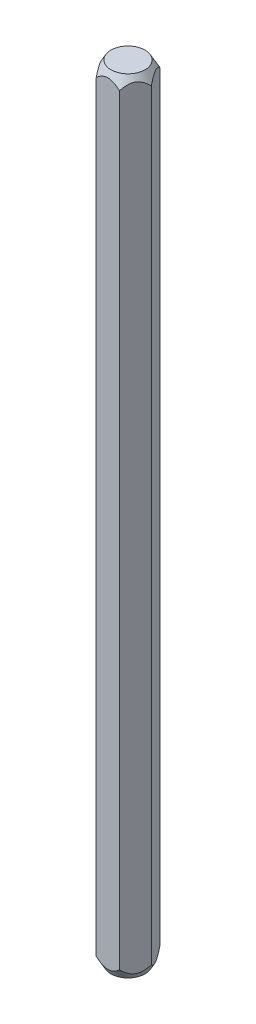
ISO-10303-21;
HEADER;
FILE_DESCRIPTION(('STEP AP214'),'2;1');
FILE_NAME('part.step','',(''),(''),'','','');
FILE_SCHEMA(('AUTOMOTIVE_DESIGN { 1 0 10303 214 1 1 1 1 }'));
ENDSEC;
DATA;
#1=APPLICATION_CONTEXT('core data for automotive mechanical design processes');
#2=APPLICATION_PROTOCOL_DEFINITION('international standard','automotive_design',2000,#1);
#3=PRODUCT_CONTEXT('',#1,'mechanical');
#4=PRODUCT('Part','Part','',(#3));
#5=PRODUCT_RELATED_PRODUCT_CATEGORY('part','',(#4));
#6=PRODUCT_DEFINITION_FORMATION('','',#4);
#7=PRODUCT_DEFINITION_CONTEXT('part definition',#1,'design');
#8=PRODUCT_DEFINITION('design','',#6,#7);
#9=PRODUCT_DEFINITION_SHAPE('','',#8);
#10=(LENGTH_UNIT() NAMED_UNIT(*) SI_UNIT(.MILLI.,.METRE.));
#11=(NAMED_UNIT(*) PLANE_ANGLE_UNIT() SI_UNIT($,.RADIAN.));
#12=(NAMED_UNIT(*) SI_UNIT($,.STERADIAN.) SOLID_ANGLE_UNIT());
#13=UNCERTAINTY_MEASURE_WITH_UNIT(LENGTH_MEASURE(1.E-05),#10,'distance_accuracy_value','');
#14=(GEOMETRIC_REPRESENTATION_CONTEXT(3) GLOBAL_UNCERTAINTY_ASSIGNED_CONTEXT((#13)) GLOBAL_UNIT_ASSIGNED_CONTEXT((#10,
#11,#12)) REPRESENTATION_CONTEXT('',''));
#15=CARTESIAN_POINT('',(0.,0.,0.));
#16=DIRECTION('',(0.,0.,1.));
#17=DIRECTION('',(1.,0.,0.));
#18=AXIS2_PLACEMENT_3D('',#15,#16,#17);
#19=CARTESIAN_POINT('',(0.,-25.25,0.));
#20=DIRECTION('',(0.,1.,0.));
#21=DIRECTION('',(0.,0.,1.));
#22=AXIS2_PLACEMENT_3D('',#19,#20,#21);
#23=PLANE('',#22);
#24=CARTESIAN_POINT('',(0.,-25.25,0.));
#25=DIRECTION('',(0.,-1.,0.));
#26=DIRECTION('',(0.,0.,-1.));
#27=AXIS2_PLACEMENT_3D('',#24,#25,#26);
#28=CIRCLE('',#27,1.1);
#29=CARTESIAN_POINT('',(0.,-25.25,-1.1));
#30=VERTEX_POINT('',#29);
#31=EDGE_CURVE('E212',#30,#30,#28,.T.);
#32=ORIENTED_EDGE('',*,*,#31,.T.);
#33=EDGE_LOOP('',(#32));
#34=FACE_BOUND('',#33,.T.);
#35=ADVANCED_FACE('F36',(#34),#23,.F.);
#36=CARTESIAN_POINT('',(0.,-24.55,0.));
#37=DIRECTION('',(0.,1.,0.));
#38=DIRECTION('',(0.,0.,1.));
#39=AXIS2_PLACEMENT_3D('',#36,#37,#38);
#40=CONICAL_SURFACE('',#39,1.5,0.519146114246523);
#41=ORIENTED_EDGE('',*,*,#31,.F.);
#42=EDGE_LOOP('',(#41));
#43=FACE_BOUND('',#42,.T.);
#44=CARTESIAN_POINT('',(-2.07253485495862,-22.8945054642753,1.29903810567668));
#45=CARTESIAN_POINT('',(-2.03538623793565,-22.9495854387625,1.29903810567668));
#46=CARTESIAN_POINT('',(-1.99804778135317,-23.0045379106194,1.29903810567668));
#47=CARTESIAN_POINT('',(-1.92291943767534,-23.1141377250613,1.29903810567668));
#48=CARTESIAN_POINT('',(-1.8851295256883,-23.1687850505755,1.29903810567668));
#49=CARTESIAN_POINT('',(-1.77082429318834,-23.3324095365471,1.29903810567668));
#50=CARTESIAN_POINT('',(-1.69352606536809,-23.440841663383,1.29903810567667));
#51=CARTESIAN_POINT('',(-1.53196552591618,-23.6611605751849,1.29903810567667));
#52=CARTESIAN_POINT('',(-1.4475497655709,-23.7729362538769,1.29903810567667));
#53=CARTESIAN_POINT('',(-1.31736248949665,-23.937707759074,1.29903810567667));
#54=CARTESIAN_POINT('',(-1.27339385596721,-23.9921251999243,1.29903810567667));
#55=CARTESIAN_POINT('',(-1.18394248532173,-24.0996971859777,1.29903810567667));
#56=CARTESIAN_POINT('',(-1.13845992720303,-24.1528518792159,1.29903810567667));
#57=CARTESIAN_POINT('',(-1.04606630373219,-24.2568956974134,1.29903810567667));
#58=CARTESIAN_POINT('',(-0.999175897510057,-24.3078030562562,1.29903810567667));
#59=CARTESIAN_POINT('',(-0.902905518082989,-24.4073290918742,1.29903810567667));
#60=CARTESIAN_POINT('',(-0.853523188312265,-24.4559455148546,1.29903810567667));
#61=CARTESIAN_POINT('',(-0.75213226077416,-24.5492068812944,1.29903810567666));
#62=CARTESIAN_POINT('',(-0.700159699118796,-24.5938905358105,1.29903810567666));
#63=CARTESIAN_POINT('',(-0.592198590812934,-24.67803583742,1.29903810567666));
#64=CARTESIAN_POINT('',(-0.536218911719418,-24.7175084969099,1.29903810567666));
#65=CARTESIAN_POINT('',(-0.433498084070139,-24.7795405301596,1.29903810567666));
#66=CARTESIAN_POINT('',(-0.387849628266953,-24.8038748512374,1.29903810567666));
#67=CARTESIAN_POINT('',(-0.293526604004846,-24.8457302033474,1.29903810567666));
#68=CARTESIAN_POINT('',(-0.244858958002785,-24.863266197404,1.29903810567666));
#69=CARTESIAN_POINT('',(-0.153193150401335,-24.8870694717298,1.29903810567666));
#70=CARTESIAN_POINT('',(-0.110559843935739,-24.8947054155175,1.29903810567666));
#71=CARTESIAN_POINT('',(-0.0245950358367204,-24.9025133256309,1.29903810567666));
#72=CARTESIAN_POINT('',(0.0187362836021565,-24.9026872090989,1.29903810567666));
#73=CARTESIAN_POINT('',(0.104675897111498,-24.8955528412023,1.29903810567666));
#74=CARTESIAN_POINT('',(0.147285340581522,-24.8882579036111,1.29903810567666));
#75=CARTESIAN_POINT('',(0.230844394471177,-24.8672064684648,1.29903810567665));
#76=CARTESIAN_POINT('',(0.271792683893705,-24.8534449338227,1.29903810567665));
#77=CARTESIAN_POINT('',(0.379155683060805,-24.8096243102184,1.29903810567665));
#78=CARTESIAN_POINT('',(0.443632811839523,-24.774872986136,1.29903810567665));
#79=CARTESIAN_POINT('',(0.536093495284723,-24.7162230265959,1.29903810567665));
#80=CARTESIAN_POINT('',(0.566280834868058,-24.6955205799594,1.29903810567665));
#81=CARTESIAN_POINT('',(0.625395796048654,-24.6523888180353,1.29903810567665));
#82=CARTESIAN_POINT('',(0.654323878891212,-24.6299601435129,1.29903810567665));
#83=CARTESIAN_POINT('',(0.731646260557356,-24.5670177665695,1.29903810567665));
#84=CARTESIAN_POINT('',(0.778952826746301,-24.5251785470326,1.29903810567665));
#85=CARTESIAN_POINT('',(0.871034974400614,-24.4387832099594,1.29903810567665));
#86=CARTESIAN_POINT('',(0.915808803866984,-24.3942252549995,1.29903810567665));
#87=CARTESIAN_POINT('',(1.00345191718129,-24.3030954920219,1.29903810567665));
#88=CARTESIAN_POINT('',(1.04631674732251,-24.2565194285746,1.29903810567665));
#89=CARTESIAN_POINT('',(1.13045799987154,-24.1619490096584,1.29903810567665));
#90=CARTESIAN_POINT('',(1.17173414809037,-24.1139544118706,1.29903810567664));
#91=CARTESIAN_POINT('',(1.29402411346602,-23.9679577797709,1.29903810567664));
#92=CARTESIAN_POINT('',(1.37311876688962,-23.8683520364851,1.29903810567664));
#93=CARTESIAN_POINT('',(1.52779498622431,-23.6666840738683,1.29903810567664));
#94=CARTESIAN_POINT('',(1.60338079775171,-23.5646250626919,1.29903810567664));
#95=CARTESIAN_POINT('',(1.74551356738804,-23.3679594614914,1.29903810567664));
#96=CARTESIAN_POINT('',(1.81226533710322,-23.2735002712326,1.29903810567664));
#97=CARTESIAN_POINT('',(1.94369038410245,-23.0843046189558,1.29903810567664));
#98=CARTESIAN_POINT('',(2.0083763111309,-22.989576959479,1.29903810567664));
#99=CARTESIAN_POINT('',(2.07253485495867,-22.8945054642753,1.29903810567664));
#100=B_SPLINE_CURVE_WITH_KNOTS('',3,(#44,#45,#46,#47,#48,#49,#50,#51,#52,#53,#54,#55,#56,#57,
#58,#59,#60,#61,#62,#63,#64,#65,#66,#67,#68,#69,#70,#71,#72,#73,#74,#75,#76,#77,#78,#79,#80,#81,
#82,#83,#84,#85,#86,#87,#88,#89,#90,#91,#92,#93,#94,#95,#96,#97,#98,#99),.UNSPECIFIED.,.F.,.F.,
(4,2,2,2,2,2,2,2,2,2,2,2,2,2,2,2,2,2,2,2,2,2,2,2,2,2,2,4),(0.,0.199309941791665,
0.398630924034156,0.798094667911537,1.21820476163973,1.42806663426301,1.63790378160688,
1.84548111764697,2.05325857539453,2.25868516950042,2.46367043823924,2.6184799554092,
2.77294677782484,2.90229727841162,3.03161454624822,3.16070169633708,3.289889564593,
3.50827500154841,3.61806680102763,3.72781804122221,3.91711654272996,4.10654442762104,
4.29639328838322,4.48627476936935,4.8677118251966,5.24867463357981,5.59565170158735,
5.93975000862929),.UNSPECIFIED.);
#101=CARTESIAN_POINT('',(-0.749999999999988,-24.55,1.29903810567666));
#102=VERTEX_POINT('',#101);
#103=CARTESIAN_POINT('',(0.750000000000015,-24.55,1.29903810567665));
#104=VERTEX_POINT('',#103);
#105=EDGE_CURVE('E206',#102,#104,#100,.T.);
#106=ORIENTED_EDGE('',*,*,#105,.F.);
#107=CARTESIAN_POINT('',(-1.50011427265704,-24.5498,-0.000197926047899849));
#108=CARTESIAN_POINT('',(-1.4844560329754,-24.577174757968,0.0269229406377882));
#109=CARTESIAN_POINT('',(-1.46848195449817,-24.6038800893295,0.0545908561644519));
#110=CARTESIAN_POINT('',(-1.43569548405084,-24.6555169111973,0.111378688780085));
#111=CARTESIAN_POINT('',(-1.41887901814407,-24.6804380044115,0.140505662134346));
#112=CARTESIAN_POINT('',(-1.38391500160077,-24.7283836425917,0.201065115224031));
#113=CARTESIAN_POINT('',(-1.36574408969252,-24.7513411744891,0.23253805786898));
#114=CARTESIAN_POINT('',(-1.32841093508815,-24.7936117266531,0.297200978450569));
#115=CARTESIAN_POINT('',(-1.30925105807725,-24.8129329732754,0.33038685890021));
#116=CARTESIAN_POINT('',(-1.26838798330661,-24.8480525589006,0.401163780556443));
#117=CARTESIAN_POINT('',(-1.24660186054835,-24.8634770395848,0.43889845207369));
#118=CARTESIAN_POINT('',(-1.20221357157386,-24.8869483088712,0.515781223838549));
#119=CARTESIAN_POINT('',(-1.17961959829794,-24.8950547788082,0.554915133497292));
#120=CARTESIAN_POINT('',(-1.13384224962676,-24.9028895799723,0.634203827231581));
#121=CARTESIAN_POINT('',(-1.11065535633217,-24.9025397632328,0.674364704487473));
#122=CARTESIAN_POINT('',(-1.06467286203397,-24.8933215388631,0.754008720870708));
#123=CARTESIAN_POINT('',(-1.04187839232794,-24.8844317002164,0.793489900533146));
#124=CARTESIAN_POINT('',(-0.991146983129713,-24.8560006684914,0.881359278804034));
#125=CARTESIAN_POINT('',(-0.963537845666472,-24.8341886627298,0.92917970764352));
#126=CARTESIAN_POINT('',(-0.910253599849041,-24.7823504473517,1.0214707286423));
#127=CARTESIAN_POINT('',(-0.884588776237872,-24.7522839857869,1.06592350710414));
#128=CARTESIAN_POINT('',(-0.840391512775698,-24.693815750008,1.14247541297613));
#129=CARTESIAN_POINT('',(-0.821509551399778,-24.6664389030966,1.17517992942577));
#130=CARTESIAN_POINT('',(-0.784926482622608,-24.6095575952382,1.23854366324462));
#131=CARTESIAN_POINT('',(-0.767213792789506,-24.5800831132095,1.26922294197426));
#132=CARTESIAN_POINT('',(-0.749885727342729,-24.5497999999996,1.29923603172495));
#133=B_SPLINE_CURVE_WITH_KNOTS('',3,(#107,#108,#109,#110,#111,#112,#113,#114,#115,#116,#117,
#118,#119,#120,#121,#122,#123,#124,#125,#126,#127,#128,#129,#130,#131,#132),.UNSPECIFIED.,.F.,
.F.,(4,2,2,2,2,2,2,2,2,2,2,2,4),(0.,0.124825594013034,0.250327656131257,0.379126359053955,
0.507630083264508,0.645790755097725,0.7828142157728,0.921104445712332,1.05974262128002,
1.23684404007381,1.41482490290691,1.5546504669262,1.69277279754432),.UNSPECIFIED.);
#134=CARTESIAN_POINT('',(-1.5,-24.55,0.));
#135=VERTEX_POINT('',#134);
#136=EDGE_CURVE('E208',#135,#102,#133,.T.);
#137=ORIENTED_EDGE('',*,*,#136,.F.);
#138=CARTESIAN_POINT('',(-0.749885727342747,-24.5497999999996,-1.29923603172494));
#139=CARTESIAN_POINT('',(-0.765543967024384,-24.5771747579676,-1.27211516503926));
#140=CARTESIAN_POINT('',(-0.781518045501617,-24.6038800893291,-1.2444472495126));
#141=CARTESIAN_POINT('',(-0.814304515948945,-24.655516911197,-1.18765941689697));
#142=CARTESIAN_POINT('',(-0.831120981855705,-24.6804380044111,-1.15853244354271));
#143=CARTESIAN_POINT('',(-0.866084998399008,-24.7283836425914,-1.09797299045303));
#144=CARTESIAN_POINT('',(-0.884255910307257,-24.7513411744888,-1.06650004780808));
#145=CARTESIAN_POINT('',(-0.921589064911621,-24.7936117266528,-1.0018371272265));
#146=CARTESIAN_POINT('',(-0.940748941922514,-24.8129329732752,-0.968651246776862));
#147=CARTESIAN_POINT('',(-0.981612016693152,-24.8480525589004,-0.89787432512063));
#148=CARTESIAN_POINT('',(-1.00339813945142,-24.8634770395847,-0.860139653603381));
#149=CARTESIAN_POINT('',(-1.04778642842591,-24.8869483088711,-0.783256881838516));
#150=CARTESIAN_POINT('',(-1.07038040170183,-24.8950547788082,-0.744122972179768));
#151=CARTESIAN_POINT('',(-1.11615775037302,-24.9028895799723,-0.664834278445462));
#152=CARTESIAN_POINT('',(-1.13934464366761,-24.9025397632328,-0.624673401189559));
#153=CARTESIAN_POINT('',(-1.18532713796583,-24.8933215388632,-0.545029384806297));
#154=CARTESIAN_POINT('',(-1.20812160767187,-24.8844317002165,-0.505548205143846));
#155=CARTESIAN_POINT('',(-1.25885301687008,-24.8560006684915,-0.417678826872971));
#156=CARTESIAN_POINT('',(-1.28646215433331,-24.83418866273,-0.369858398033508));
#157=CARTESIAN_POINT('',(-1.33974640015071,-24.7823504473519,-0.277567377034771));
#158=CARTESIAN_POINT('',(-1.36541122376187,-24.7522839857872,-0.233114598572952));
#159=CARTESIAN_POINT('',(-1.40960848722404,-24.6938157500083,-0.156562692700964));
#160=CARTESIAN_POINT('',(-1.42849044859997,-24.6664389030969,-0.123858176251305));
#161=CARTESIAN_POINT('',(-1.46507351737715,-24.6095575952385,-0.060494442432438));
#162=CARTESIAN_POINT('',(-1.48278620721026,-24.5800831132099,-0.0298151637027866));
#163=CARTESIAN_POINT('',(-1.50011427265704,-24.5498,0.000197926047920182));
#164=B_SPLINE_CURVE_WITH_KNOTS('',3,(#138,#139,#140,#141,#142,#143,#144,#145,#146,#147,#148,
#149,#150,#151,#152,#153,#154,#155,#156,#157,#158,#159,#160,#161,#162,#163),.UNSPECIFIED.,.F.,
.F.,(4,2,2,2,2,2,2,2,2,2,2,2,4),(0.,0.124825594013049,0.250327656131287,0.379126359054002,
0.507630083264572,0.64579075509782,0.782814215772928,0.921104445712497,1.05974262128022,
1.23684404007388,1.41482490290687,1.55465046692618,1.69277279754432),.UNSPECIFIED.);
#165=CARTESIAN_POINT('',(-0.750000000000006,-24.55,-1.29903810567665));
#166=VERTEX_POINT('',#165);
#167=EDGE_CURVE('E93',#166,#135,#164,.T.);
#168=ORIENTED_EDGE('',*,*,#167,.F.);
#169=CARTESIAN_POINT('',(2.07253485495863,-22.8945054642753,-1.29903810567666));
#170=CARTESIAN_POINT('',(2.03538623793566,-22.9495854387625,-1.29903810567666));
#171=CARTESIAN_POINT('',(1.99804778135318,-23.0045379106194,-1.29903810567666));
#172=CARTESIAN_POINT('',(1.92291943767535,-23.1141377250613,-1.29903810567666));
#173=CARTESIAN_POINT('',(1.88512952568831,-23.1687850505755,-1.29903810567666));
#174=CARTESIAN_POINT('',(1.77082429318834,-23.3324095365471,-1.29903810567666));
#175=CARTESIAN_POINT('',(1.6935260653681,-23.440841663383,-1.29903810567666));
#176=CARTESIAN_POINT('',(1.53196552591619,-23.6611605751849,-1.29903810567666));
#177=CARTESIAN_POINT('',(1.44754976557091,-23.7729362538769,-1.29903810567666));
#178=CARTESIAN_POINT('',(1.31736248949666,-23.937707759074,-1.29903810567666));
#179=CARTESIAN_POINT('',(1.27339385596722,-23.9921251999243,-1.29903810567666));
#180=CARTESIAN_POINT('',(1.18394248532174,-24.0996971859777,-1.29903810567666));
#181=CARTESIAN_POINT('',(1.13845992720304,-24.1528518792159,-1.29903810567666));
#182=CARTESIAN_POINT('',(1.0460663037322,-24.2568956974134,-1.29903810567666));
#183=CARTESIAN_POINT('',(0.999175897510066,-24.3078030562562,-1.29903810567666));
#184=CARTESIAN_POINT('',(0.902905518082998,-24.4073290918742,-1.29903810567666));
#185=CARTESIAN_POINT('',(0.853523188312275,-24.4559455148546,-1.29903810567666));
#186=CARTESIAN_POINT('',(0.752132260774169,-24.5492068812944,-1.29903810567666));
#187=CARTESIAN_POINT('',(0.700159699118804,-24.5938905358105,-1.29903810567666));
#188=CARTESIAN_POINT('',(0.592198590812942,-24.67803583742,-1.29903810567666));
#189=CARTESIAN_POINT('',(0.536218911719427,-24.7175084969099,-1.29903810567666));
#190=CARTESIAN_POINT('',(0.433498084070147,-24.7795405301596,-1.29903810567666));
#191=CARTESIAN_POINT('',(0.387849628266961,-24.8038748512374,-1.29903810567666));
#192=CARTESIAN_POINT('',(0.293526604004854,-24.8457302033474,-1.29903810567666));
#193=CARTESIAN_POINT('',(0.244858958002793,-24.863266197404,-1.29903810567666));
#194=CARTESIAN_POINT('',(0.153193150401342,-24.8870694717298,-1.29903810567666));
#195=CARTESIAN_POINT('',(0.110559843935746,-24.8947054155175,-1.29903810567666));
#196=CARTESIAN_POINT('',(0.0245950358367268,-24.9025133256309,-1.29903810567666));
#197=CARTESIAN_POINT('',(-0.0187362836021501,-24.9026872090989,-1.29903810567666));
#198=CARTESIAN_POINT('',(-0.104675897111492,-24.8955528412023,-1.29903810567666));
#199=CARTESIAN_POINT('',(-0.147285340581515,-24.8882579036111,-1.29903810567666));
#200=CARTESIAN_POINT('',(-0.23084439447117,-24.8672064684648,-1.29903810567666));
#201=CARTESIAN_POINT('',(-0.271792683893699,-24.8534449338227,-1.29903810567666));
#202=CARTESIAN_POINT('',(-0.3791556830608,-24.8096243102184,-1.29903810567666));
#203=CARTESIAN_POINT('',(-0.443632811839519,-24.774872986136,-1.29903810567666));
#204=CARTESIAN_POINT('',(-0.53609349528472,-24.7162230265959,-1.29903810567666));
#205=CARTESIAN_POINT('',(-0.566280834868054,-24.6955205799594,-1.29903810567666));
#206=CARTESIAN_POINT('',(-0.62539579604865,-24.6523888180353,-1.29903810567665));
#207=CARTESIAN_POINT('',(-0.654323878891208,-24.6299601435129,-1.29903810567665));
#208=CARTESIAN_POINT('',(-0.731646260557353,-24.5670177665695,-1.29903810567665));
#209=CARTESIAN_POINT('',(-0.778952826746299,-24.5251785470326,-1.29903810567665));
#210=CARTESIAN_POINT('',(-0.871034974400613,-24.4387832099594,-1.29903810567665));
#211=CARTESIAN_POINT('',(-0.915808803866984,-24.3942252549995,-1.29903810567665));
#212=CARTESIAN_POINT('',(-1.00345191718129,-24.3030954920219,-1.29903810567665));
#213=CARTESIAN_POINT('',(-1.04631674732251,-24.2565194285746,-1.29903810567665));
#214=CARTESIAN_POINT('',(-1.13045799987154,-24.1619490096584,-1.29903810567665));
#215=CARTESIAN_POINT('',(-1.17173414809037,-24.1139544118706,-1.29903810567665));
#216=CARTESIAN_POINT('',(-1.29402411346602,-23.9679577797709,-1.29903810567665));
#217=CARTESIAN_POINT('',(-1.37311876688962,-23.8683520364851,-1.29903810567665));
#218=CARTESIAN_POINT('',(-1.52779498622431,-23.6666840738682,-1.29903810567665));
#219=CARTESIAN_POINT('',(-1.60338079775172,-23.5646250626919,-1.29903810567665));
#220=CARTESIAN_POINT('',(-1.74551356738804,-23.3679594614914,-1.29903810567665));
#221=CARTESIAN_POINT('',(-1.81226533710321,-23.2735002712326,-1.29903810567665));
#222=CARTESIAN_POINT('',(-1.94369038410244,-23.0843046189558,-1.29903810567665));
#223=CARTESIAN_POINT('',(-2.00837631113088,-22.9895769594791,-1.29903810567665));
#224=CARTESIAN_POINT('',(-2.07253485495864,-22.8945054642753,-1.29903810567665));
#225=B_SPLINE_CURVE_WITH_KNOTS('',3,(#169,#170,#171,#172,#173,#174,#175,#176,#177,#178,#179,
#180,#181,#182,#183,#184,#185,#186,#187,#188,#189,#190,#191,#192,#193,#194,#195,#196,#197,#198,
#199,#200,#201,#202,#203,#204,#205,#206,#207,#208,#209,#210,#211,#212,#213,#214,#215,#216,#217,
#218,#219,#220,#221,#222,#223,#224),.UNSPECIFIED.,.F.,.F.,(4,2,2,2,2,2,2,2,2,2,2,2,2,2,2,2,2,2,
2,2,2,2,2,2,2,2,2,4),(0.,0.199309941791662,0.398630924034153,0.798094667911537,1.21820476163973,
1.42806663426301,1.63790378160688,1.84548111764697,2.05325857539453,2.25868516950043,
2.46367043823924,2.6184799554092,2.77294677782484,2.90229727841163,3.03161454624822,
3.16070169633708,3.289889564593,3.50827500154842,3.61806680102764,3.72781804122221,
3.91711654272997,4.10654442762105,4.29639328838324,4.48627476936937,4.86771182519662,
5.24867463357984,5.59565170158736,5.93975000862926),.UNSPECIFIED.);
#226=CARTESIAN_POINT('',(0.749999999999997,-24.55,-1.29903810567666));
#227=VERTEX_POINT('',#226);
#228=EDGE_CURVE('E88',#227,#166,#225,.T.);
#229=ORIENTED_EDGE('',*,*,#228,.F.);
#230=CARTESIAN_POINT('',(1.50011427265704,-24.5498,0.000197926047910326));
#231=CARTESIAN_POINT('',(1.4844560329754,-24.577174757968,-0.0269229406377779));
#232=CARTESIAN_POINT('',(1.46848195449817,-24.6038800893295,-0.0545908561644416));
#233=CARTESIAN_POINT('',(1.43569548405084,-24.6555169111973,-0.111378688780075));
#234=CARTESIAN_POINT('',(1.41887901814407,-24.6804380044115,-0.140505662134336));
#235=CARTESIAN_POINT('',(1.38391500160077,-24.7283836425917,-0.201065115224022));
#236=CARTESIAN_POINT('',(1.36574408969252,-24.7513411744891,-0.232538057868971));
#237=CARTESIAN_POINT('',(1.32841093508815,-24.7936117266531,-0.29720097845056));
#238=CARTESIAN_POINT('',(1.30925105807725,-24.8129329732754,-0.330386858900201));
#239=CARTESIAN_POINT('',(1.26838798330661,-24.8480525589006,-0.401163780556435));
#240=CARTESIAN_POINT('',(1.24660186054835,-24.8634770395848,-0.438898452073682));
#241=CARTESIAN_POINT('',(1.20221357157386,-24.8869483088712,-0.515781223838541));
#242=CARTESIAN_POINT('',(1.17961959829795,-24.8950547788082,-0.554915133497284));
#243=CARTESIAN_POINT('',(1.13384224962676,-24.9028895799723,-0.634203827231574));
#244=CARTESIAN_POINT('',(1.11065535633218,-24.9025397632328,-0.674364704487465));
#245=CARTESIAN_POINT('',(1.06467286203397,-24.8933215388631,-0.754008720870701));
#246=CARTESIAN_POINT('',(1.04187839232794,-24.8844317002164,-0.793489900533139));
#247=CARTESIAN_POINT('',(0.991146983129719,-24.8560006684914,-0.881359278804027));
#248=CARTESIAN_POINT('',(0.963537845666479,-24.8341886627298,-0.929179707643513));
#249=CARTESIAN_POINT('',(0.910253599849048,-24.7823504473517,-1.02147072864229));
#250=CARTESIAN_POINT('',(0.884588776237879,-24.7522839857869,-1.06592350710413));
#251=CARTESIAN_POINT('',(0.840391512775706,-24.693815750008,-1.14247541297612));
#252=CARTESIAN_POINT('',(0.821509551399787,-24.6664389030966,-1.17517992942577));
#253=CARTESIAN_POINT('',(0.784926482622618,-24.6095575952382,-1.23854366324461));
#254=CARTESIAN_POINT('',(0.767213792789516,-24.5800831132095,-1.26922294197425));
#255=CARTESIAN_POINT('',(0.749885727342739,-24.5497999999996,-1.29923603172495));
#256=B_SPLINE_CURVE_WITH_KNOTS('',3,(#230,#231,#232,#233,#234,#235,#236,#237,#238,#239,#240,
#241,#242,#243,#244,#245,#246,#247,#248,#249,#250,#251,#252,#253,#254,#255),.UNSPECIFIED.,.F.,
.F.,(4,2,2,2,2,2,2,2,2,2,2,2,4),(0.,0.124825594013034,0.250327656131258,0.379126359053955,
0.507630083264508,0.645790755097725,0.7828142157728,0.921104445712332,1.05974262128002,
1.23684404007381,1.41482490290691,1.5546504669262,1.69277279754432),.UNSPECIFIED.);
#257=CARTESIAN_POINT('',(1.5,-24.55,0.));
#258=VERTEX_POINT('',#257);
#259=EDGE_CURVE('E91',#258,#227,#256,.T.);
#260=ORIENTED_EDGE('',*,*,#259,.F.);
#261=CARTESIAN_POINT('',(0.749885727342757,-24.5497999999996,1.29923603172494));
#262=CARTESIAN_POINT('',(0.765543967024393,-24.5771747579676,1.27211516503925));
#263=CARTESIAN_POINT('',(0.781518045501626,-24.6038800893291,1.24444724951259));
#264=CARTESIAN_POINT('',(0.814304515948955,-24.655516911197,1.18765941689696));
#265=CARTESIAN_POINT('',(0.831120981855715,-24.6804380044111,1.1585324435427));
#266=CARTESIAN_POINT('',(0.866084998399017,-24.7283836425914,1.09797299045302));
#267=CARTESIAN_POINT('',(0.884255910307267,-24.7513411744888,1.06650004780808));
#268=CARTESIAN_POINT('',(0.921589064911631,-24.7936117266528,1.00183712722649));
#269=CARTESIAN_POINT('',(0.940748941922524,-24.8129329732752,0.968651246776854));
#270=CARTESIAN_POINT('',(0.981612016693162,-24.8480525589004,0.897874325120622));
#271=CARTESIAN_POINT('',(1.00339813945143,-24.8634770395847,0.860139653603374));
#272=CARTESIAN_POINT('',(1.04778642842592,-24.8869483088711,0.783256881838509));
#273=CARTESIAN_POINT('',(1.07038040170184,-24.8950547788081,0.74412297217976));
#274=CARTESIAN_POINT('',(1.11615775037303,-24.9028895799723,0.664834278445455));
#275=CARTESIAN_POINT('',(1.13934464366762,-24.9025397632328,0.624673401189552));
#276=CARTESIAN_POINT('',(1.18532713796584,-24.8933215388632,0.545029384806291));
#277=CARTESIAN_POINT('',(1.20812160767188,-24.8844317002165,0.50554820514384));
#278=CARTESIAN_POINT('',(1.25885301687009,-24.8560006684915,0.417678826872965));
#279=CARTESIAN_POINT('',(1.28646215433332,-24.83418866273,0.369858398033502));
#280=CARTESIAN_POINT('',(1.33974640015072,-24.7823504473519,0.277567377034764));
#281=CARTESIAN_POINT('',(1.36541122376188,-24.7522839857872,0.233114598572944));
#282=CARTESIAN_POINT('',(1.40960848722405,-24.6938157500083,0.15656269270096));
#283=CARTESIAN_POINT('',(1.42849044859997,-24.6664389030969,0.123858176251304));
#284=CARTESIAN_POINT('',(1.46507351737715,-24.6095575952385,0.0604944424324435));
#285=CARTESIAN_POINT('',(1.48278620721026,-24.5800831132099,0.0298151637027945));
#286=CARTESIAN_POINT('',(1.50011427265704,-24.5498,-0.000197926047909581));
#287=B_SPLINE_CURVE_WITH_KNOTS('',3,(#261,#262,#263,#264,#265,#266,#267,#268,#269,#270,#271,
#272,#273,#274,#275,#276,#277,#278,#279,#280,#281,#282,#283,#284,#285,#286),.UNSPECIFIED.,.F.,
.F.,(4,2,2,2,2,2,2,2,2,2,2,2,4),(0.,0.124825594013049,0.250327656131285,0.379126359054002,
0.507630083264572,0.645790755097819,0.782814215772926,0.921104445712494,1.05974262128021,
1.23684404007388,1.41482490290688,1.55465046692616,1.69277279754429),.UNSPECIFIED.);
#288=EDGE_CURVE('E60',#104,#258,#287,.T.);
#289=ORIENTED_EDGE('',*,*,#288,.F.);
#290=EDGE_LOOP('',(#106,#137,#168,#229,#260,#289));
#291=FACE_BOUND('',#290,.T.);
#292=ADVANCED_FACE('F90',(#43,#291),#40,.T.);
#293=CARTESIAN_POINT('',(0.750000000000015,25.25,1.29903810567665));
#294=DIRECTION('',(-0.866025403784442,0.,-0.499999999999995));
#295=DIRECTION('',(-0.499999999999995,0.,0.866025403784442));
#296=AXIS2_PLACEMENT_3D('',#293,#294,#295);
#297=PLANE('',#296);
#298=DIRECTION('',(0.,-1.,0.));
#299=VECTOR('',#298,1.);
#300=CARTESIAN_POINT('',(1.5,25.25,0.));
#301=LINE('',#300,#299);
#302=CARTESIAN_POINT('',(1.5,24.55,0.));
#303=VERTEX_POINT('',#302);
#304=EDGE_CURVE('E11',#303,#258,#301,.T.);
#305=ORIENTED_EDGE('',*,*,#304,.F.);
#306=CARTESIAN_POINT('',(1.50011427265704,24.5498,-0.000197926047910144));
#307=CARTESIAN_POINT('',(1.4844560329754,24.577174757968,0.0269229406377771));
#308=CARTESIAN_POINT('',(1.46848195449817,24.6038800893295,0.0545908561644401));
#309=CARTESIAN_POINT('',(1.43569548405084,24.6555169111973,0.111378688780074));
#310=CARTESIAN_POINT('',(1.41887901814408,24.6804380044115,0.140505662134336));
#311=CARTESIAN_POINT('',(1.38391500160077,24.7283836425917,0.201065115224022));
#312=CARTESIAN_POINT('',(1.36574408969252,24.7513411744891,0.232538057868972));
#313=CARTESIAN_POINT('',(1.32841093508815,24.7936117266531,0.297200978450562));
#314=CARTESIAN_POINT('',(1.30925105807726,24.8129329732754,0.330386858900204));
#315=CARTESIAN_POINT('',(1.26838798330662,24.8480525589006,0.401163780556439));
#316=CARTESIAN_POINT('',(1.24660186054835,24.8634770395848,0.438898452073686));
#317=CARTESIAN_POINT('',(1.20221357157387,24.8869483088712,0.515781223838545));
#318=CARTESIAN_POINT('',(1.17961959829795,24.8950547788082,0.554915133497289));
#319=CARTESIAN_POINT('',(1.13384224962676,24.9028895799723,0.634203827231579));
#320=CARTESIAN_POINT('',(1.11065535633218,24.9025397632328,0.674364704487471));
#321=CARTESIAN_POINT('',(1.06467286203398,24.8933215388631,0.754008720870707));
#322=CARTESIAN_POINT('',(1.04187839232795,24.8844317002164,0.793489900533144));
#323=CARTESIAN_POINT('',(0.991146983129724,24.8560006684914,0.881359278804033));
#324=CARTESIAN_POINT('',(0.963537845666483,24.8341886627298,0.92917970764352));
#325=CARTESIAN_POINT('',(0.910253599849052,24.7823504473517,1.0214707286423));
#326=CARTESIAN_POINT('',(0.884588776237883,24.7522839857869,1.06592350710414));
#327=CARTESIAN_POINT('',(0.840391512775713,24.693815750008,1.14247541297613));
#328=CARTESIAN_POINT('',(0.821509551399796,24.6664389030966,1.17517992942577));
#329=CARTESIAN_POINT('',(0.784926482622631,24.6095575952382,1.23854366324461));
#330=CARTESIAN_POINT('',(0.767213792789532,24.5800831132095,1.26922294197424));
#331=CARTESIAN_POINT('',(0.749885727342757,24.5497999999996,1.29923603172494));
#332=B_SPLINE_CURVE_WITH_KNOTS('',3,(#306,#307,#308,#309,#310,#311,#312,#313,#314,#315,#316,
#317,#318,#319,#320,#321,#322,#323,#324,#325,#326,#327,#328,#329,#330,#331),.UNSPECIFIED.,.F.,
.F.,(4,2,2,2,2,2,2,2,2,2,2,2,4),(0.,0.124825594013029,0.250327656131255,0.379126359053954,
0.507630083264508,0.645790755097724,0.7828142157728,0.921104445712332,1.05974262128002,
1.23684404007381,1.41482490290692,1.55465046692619,1.69277279754429),.UNSPECIFIED.);
#333=CARTESIAN_POINT('',(0.750000000000015,24.55,1.29903810567665));
#334=VERTEX_POINT('',#333);
#335=EDGE_CURVE('E120',#303,#334,#332,.T.);
#336=ORIENTED_EDGE('',*,*,#335,.T.);
#337=DIRECTION('',(0.,-1.,0.));
#338=VECTOR('',#337,1.);
#339=CARTESIAN_POINT('',(0.750000000000015,25.25,1.29903810567665));
#340=LINE('',#339,#338);
#341=EDGE_CURVE('E117',#334,#104,#340,.T.);
#342=ORIENTED_EDGE('',*,*,#341,.T.);
#343=ORIENTED_EDGE('',*,*,#288,.T.);
#344=EDGE_LOOP('',(#305,#336,#342,#343));
#345=FACE_BOUND('',#344,.T.);
#346=ADVANCED_FACE('F38',(#345),#297,.F.);
#347=CARTESIAN_POINT('',(1.5,25.25,0.));
#348=DIRECTION('',(-0.866025403784438,0.,0.500000000000001));
#349=DIRECTION('',(0.500000000000001,0.,0.866025403784438));
#350=AXIS2_PLACEMENT_3D('',#347,#348,#349);
#351=PLANE('',#350);
#352=DIRECTION('',(0.,-1.,0.));
#353=VECTOR('',#352,1.);
#354=CARTESIAN_POINT('',(0.749999999999997,25.25,-1.29903810567666));
#355=LINE('',#354,#353);
#356=CARTESIAN_POINT('',(0.749999999999997,24.55,-1.29903810567666));
#357=VERTEX_POINT('',#356);
#358=EDGE_CURVE('E45',#357,#227,#355,.T.);
#359=ORIENTED_EDGE('',*,*,#358,.F.);
#360=CARTESIAN_POINT('',(0.749885727342739,24.5497999999996,-1.29923603172495));
#361=CARTESIAN_POINT('',(0.765543967024375,24.5771747579676,-1.27211516503926));
#362=CARTESIAN_POINT('',(0.781518045501609,24.6038800893291,-1.2444472495126));
#363=CARTESIAN_POINT('',(0.814304515948937,24.655516911197,-1.18765941689697));
#364=CARTESIAN_POINT('',(0.831120981855697,24.6804380044111,-1.15853244354271));
#365=CARTESIAN_POINT('',(0.866084998399,24.7283836425914,-1.09797299045303));
#366=CARTESIAN_POINT('',(0.88425591030725,24.7513411744888,-1.06650004780809));
#367=CARTESIAN_POINT('',(0.921589064911614,24.7936117266528,-1.00183712722651));
#368=CARTESIAN_POINT('',(0.940748941922507,24.8129329732752,-0.968651246776868));
#369=CARTESIAN_POINT('',(0.981612016693146,24.8480525589004,-0.897874325120636));
#370=CARTESIAN_POINT('',(1.00339813945141,24.8634770395847,-0.860139653603388));
#371=CARTESIAN_POINT('',(1.0477864284259,24.8869483088711,-0.783256881838524));
#372=CARTESIAN_POINT('',(1.07038040170182,24.8950547788082,-0.744122972179776));
#373=CARTESIAN_POINT('',(1.11615775037302,24.9028895799723,-0.664834278445471));
#374=CARTESIAN_POINT('',(1.1393446436676,24.9025397632328,-0.624673401189568));
#375=CARTESIAN_POINT('',(1.18532713796582,24.8933215388632,-0.545029384806307));
#376=CARTESIAN_POINT('',(1.20812160767186,24.8844317002165,-0.505548205143856));
#377=CARTESIAN_POINT('',(1.25885301687008,24.8560006684915,-0.417678826872981));
#378=CARTESIAN_POINT('',(1.2864621543333,24.83418866273,-0.369858398033518));
#379=CARTESIAN_POINT('',(1.33974640015071,24.7823504473519,-0.277567377034782));
#380=CARTESIAN_POINT('',(1.36541122376187,24.7522839857872,-0.233114598572963));
#381=CARTESIAN_POINT('',(1.40960848722404,24.6938157500083,-0.156562692700976));
#382=CARTESIAN_POINT('',(1.42849044859997,24.6664389030969,-0.123858176251316));
#383=CARTESIAN_POINT('',(1.46507351737715,24.6095575952385,-0.0604944424324486));
#384=CARTESIAN_POINT('',(1.48278620721026,24.5800831132099,-0.0298151637027971));
#385=CARTESIAN_POINT('',(1.50011427265704,24.5498,0.000197926047909349));
#386=B_SPLINE_CURVE_WITH_KNOTS('',3,(#360,#361,#362,#363,#364,#365,#366,#367,#368,#369,#370,
#371,#372,#373,#374,#375,#376,#377,#378,#379,#380,#381,#382,#383,#384,#385),.UNSPECIFIED.,.F.,
.F.,(4,2,2,2,2,2,2,2,2,2,2,2,4),(0.,0.124825594013046,0.250327656131285,0.379126359054,
0.50763008326457,0.645790755097817,0.782814215772924,0.921104445712493,1.05974262128021,
1.23684404007388,1.41482490290687,1.55465046692618,1.69277279754432),.UNSPECIFIED.);
#387=EDGE_CURVE('E128',#357,#303,#386,.T.);
#388=ORIENTED_EDGE('',*,*,#387,.T.);
#389=ORIENTED_EDGE('',*,*,#304,.T.);
#390=ORIENTED_EDGE('',*,*,#259,.T.);
#391=EDGE_LOOP('',(#359,#388,#389,#390));
#392=FACE_BOUND('',#391,.T.);
#393=ADVANCED_FACE('F101',(#392),#351,.F.);
#394=CARTESIAN_POINT('',(0.749999999999997,25.25,-1.29903810567666));
#395=DIRECTION('',(0.,0.,1.));
#396=DIRECTION('',(1.,0.,0.));
#397=AXIS2_PLACEMENT_3D('',#394,#395,#396);
#398=PLANE('',#397);
#399=DIRECTION('',(0.,-1.,0.));
#400=VECTOR('',#399,1.);
#401=CARTESIAN_POINT('',(-0.750000000000006,25.25,-1.29903810567665));
#402=LINE('',#401,#400);
#403=CARTESIAN_POINT('',(-0.750000000000006,24.55,-1.29903810567665));
#404=VERTEX_POINT('',#403);
#405=EDGE_CURVE('E108',#404,#166,#402,.T.);
#406=ORIENTED_EDGE('',*,*,#405,.F.);
#407=CARTESIAN_POINT('',(-2.07253485495864,22.8945054642753,-1.29903810567665));
#408=CARTESIAN_POINT('',(-2.03538623793567,22.9495854387625,-1.29903810567665));
#409=CARTESIAN_POINT('',(-1.99804778135319,23.0045379106194,-1.29903810567665));
#410=CARTESIAN_POINT('',(-1.92291943767536,23.1141377250613,-1.29903810567665));
#411=CARTESIAN_POINT('',(-1.88512952568831,23.1687850505755,-1.29903810567665));
#412=CARTESIAN_POINT('',(-1.77082429318835,23.3324095365471,-1.29903810567665));
#413=CARTESIAN_POINT('',(-1.69352606536811,23.440841663383,-1.29903810567665));
#414=CARTESIAN_POINT('',(-1.5319655259162,23.6611605751849,-1.29903810567665));
#415=CARTESIAN_POINT('',(-1.44754976557092,23.7729362538768,-1.29903810567665));
#416=CARTESIAN_POINT('',(-1.31736248949667,23.937707759074,-1.29903810567665));
#417=CARTESIAN_POINT('',(-1.27339385596723,23.9921251999243,-1.29903810567665));
#418=CARTESIAN_POINT('',(-1.18394248532175,24.0996971859777,-1.29903810567665));
#419=CARTESIAN_POINT('',(-1.13845992720305,24.1528518792159,-1.29903810567665));
#420=CARTESIAN_POINT('',(-1.04606630373221,24.2568956974134,-1.29903810567665));
#421=CARTESIAN_POINT('',(-0.999175897510075,24.3078030562562,-1.29903810567665));
#422=CARTESIAN_POINT('',(-0.902905518083007,24.4073290918742,-1.29903810567665));
#423=CARTESIAN_POINT('',(-0.853523188312284,24.4559455148546,-1.29903810567665));
#424=CARTESIAN_POINT('',(-0.752132260774178,24.5492068812944,-1.29903810567665));
#425=CARTESIAN_POINT('',(-0.700159699118813,24.5938905358105,-1.29903810567665));
#426=CARTESIAN_POINT('',(-0.592198590812951,24.67803583742,-1.29903810567666));
#427=CARTESIAN_POINT('',(-0.536218911719436,24.7175084969099,-1.29903810567666));
#428=CARTESIAN_POINT('',(-0.433498084070156,24.7795405301596,-1.29903810567666));
#429=CARTESIAN_POINT('',(-0.38784962826697,24.8038748512374,-1.29903810567666));
#430=CARTESIAN_POINT('',(-0.293526604004863,24.8457302033474,-1.29903810567666));
#431=CARTESIAN_POINT('',(-0.244858958002802,24.863266197404,-1.29903810567666));
#432=CARTESIAN_POINT('',(-0.153193150401351,24.8870694717298,-1.29903810567666));
#433=CARTESIAN_POINT('',(-0.110559843935755,24.8947054155175,-1.29903810567666));
#434=CARTESIAN_POINT('',(-0.0245950358367362,24.9025133256309,-1.29903810567666));
#435=CARTESIAN_POINT('',(0.0187362836021408,24.9026872090989,-1.29903810567666));
#436=CARTESIAN_POINT('',(0.104675897111482,24.8955528412023,-1.29903810567666));
#437=CARTESIAN_POINT('',(0.147285340581506,24.8882579036111,-1.29903810567666));
#438=CARTESIAN_POINT('',(0.230844394471161,24.8672064684648,-1.29903810567666));
#439=CARTESIAN_POINT('',(0.271792683893689,24.8534449338227,-1.29903810567666));
#440=CARTESIAN_POINT('',(0.379155683060791,24.8096243102184,-1.29903810567666));
#441=CARTESIAN_POINT('',(0.443632811839509,24.774872986136,-1.29903810567666));
#442=CARTESIAN_POINT('',(0.53609349528471,24.7162230265959,-1.29903810567666));
#443=CARTESIAN_POINT('',(0.566280834868044,24.6955205799594,-1.29903810567666));
#444=CARTESIAN_POINT('',(0.62539579604864,24.6523888180353,-1.29903810567666));
#445=CARTESIAN_POINT('',(0.654323878891198,24.6299601435129,-1.29903810567666));
#446=CARTESIAN_POINT('',(0.731646260557342,24.5670177665695,-1.29903810567666));
#447=CARTESIAN_POINT('',(0.778952826746288,24.5251785470326,-1.29903810567666));
#448=CARTESIAN_POINT('',(0.871034974400601,24.4387832099594,-1.29903810567666));
#449=CARTESIAN_POINT('',(0.915808803866971,24.3942252549995,-1.29903810567666));
#450=CARTESIAN_POINT('',(1.00345191718128,24.3030954920219,-1.29903810567666));
#451=CARTESIAN_POINT('',(1.04631674732249,24.2565194285746,-1.29903810567666));
#452=CARTESIAN_POINT('',(1.13045799987153,24.1619490096584,-1.29903810567666));
#453=CARTESIAN_POINT('',(1.17173414809035,24.1139544118706,-1.29903810567666));
#454=CARTESIAN_POINT('',(1.29402411346601,23.9679577797709,-1.29903810567666));
#455=CARTESIAN_POINT('',(1.3731187668896,23.8683520364851,-1.29903810567666));
#456=CARTESIAN_POINT('',(1.5277949862243,23.6666840738683,-1.29903810567666));
#457=CARTESIAN_POINT('',(1.6033807977517,23.5646250626919,-1.29903810567666));
#458=CARTESIAN_POINT('',(1.74551356738803,23.3679594614914,-1.29903810567666));
#459=CARTESIAN_POINT('',(1.8122653371032,23.2735002712326,-1.29903810567666));
#460=CARTESIAN_POINT('',(1.94369038410243,23.0843046189558,-1.29903810567666));
#461=CARTESIAN_POINT('',(2.00837631113087,22.9895769594791,-1.29903810567666));
#462=CARTESIAN_POINT('',(2.07253485495863,22.8945054642753,-1.29903810567666));
#463=B_SPLINE_CURVE_WITH_KNOTS('',3,(#407,#408,#409,#410,#411,#412,#413,#414,#415,#416,#417,
#418,#419,#420,#421,#422,#423,#424,#425,#426,#427,#428,#429,#430,#431,#432,#433,#434,#435,#436,
#437,#438,#439,#440,#441,#442,#443,#444,#445,#446,#447,#448,#449,#450,#451,#452,#453,#454,#455,
#456,#457,#458,#459,#460,#461,#462),.UNSPECIFIED.,.F.,.F.,(4,2,2,2,2,2,2,2,2,2,2,2,2,2,2,2,2,2,
2,2,2,2,2,2,2,2,2,4),(0.,0.199309941791661,0.398630924034153,0.798094667911537,1.21820476163973,
1.42806663426301,1.63790378160688,1.84548111764697,2.05325857539453,2.25868516950042,
2.46367043823923,2.6184799554092,2.77294677782484,2.90229727841163,3.03161454624822,
3.16070169633708,3.289889564593,3.50827500154842,3.61806680102764,3.72781804122221,
3.91711654272996,4.10654442762105,4.29639328838323,4.48627476936936,4.86771182519661,
5.24867463357983,5.59565170158735,5.93975000862926),.UNSPECIFIED.);
#464=EDGE_CURVE('E107',#404,#357,#463,.T.);
#465=ORIENTED_EDGE('',*,*,#464,.T.);
#466=ORIENTED_EDGE('',*,*,#358,.T.);
#467=ORIENTED_EDGE('',*,*,#228,.T.);
#468=EDGE_LOOP('',(#406,#465,#466,#467));
#469=FACE_BOUND('',#468,.T.);
#470=ADVANCED_FACE('F106',(#469),#398,.F.);
#471=CARTESIAN_POINT('',(-0.750000000000006,25.25,-1.29903810567665));
#472=DIRECTION('',(0.866025403784442,0.,0.499999999999995));
#473=DIRECTION('',(0.499999999999995,0.,-0.866025403784442));
#474=AXIS2_PLACEMENT_3D('',#471,#472,#473);
#475=PLANE('',#474);
#476=DIRECTION('',(0.,-1.,0.));
#477=VECTOR('',#476,1.);
#478=CARTESIAN_POINT('',(-1.5,25.25,0.));
#479=LINE('',#478,#477);
#480=CARTESIAN_POINT('',(-1.5,24.55,0.));
#481=VERTEX_POINT('',#480);
#482=EDGE_CURVE('E109',#481,#135,#479,.T.);
#483=ORIENTED_EDGE('',*,*,#482,.F.);
#484=CARTESIAN_POINT('',(-1.50011427265704,24.5498,0.000197926047920883));
#485=CARTESIAN_POINT('',(-1.4844560329754,24.577174757968,-0.0269229406377675));
#486=CARTESIAN_POINT('',(-1.46848195449817,24.6038800893295,-0.0545908561644314));
#487=CARTESIAN_POINT('',(-1.43569548405084,24.6555169111973,-0.111378688780065));
#488=CARTESIAN_POINT('',(-1.41887901814408,24.6804380044115,-0.140505662134326));
#489=CARTESIAN_POINT('',(-1.38391500160077,24.7283836425917,-0.201065115224011));
#490=CARTESIAN_POINT('',(-1.36574408969252,24.7513411744891,-0.232538057868961));
#491=CARTESIAN_POINT('',(-1.32841093508815,24.7936117266531,-0.29720097845055));
#492=CARTESIAN_POINT('',(-1.30925105807726,24.8129329732754,-0.330386858900191));
#493=CARTESIAN_POINT('',(-1.26838798330662,24.8480525589006,-0.401163780556425));
#494=CARTESIAN_POINT('',(-1.24660186054835,24.8634770395848,-0.438898452073672));
#495=CARTESIAN_POINT('',(-1.20221357157387,24.8869483088712,-0.515781223838531));
#496=CARTESIAN_POINT('',(-1.17961959829795,24.8950547788082,-0.554915133497275));
#497=CARTESIAN_POINT('',(-1.13384224962676,24.9028895799723,-0.634203827231565));
#498=CARTESIAN_POINT('',(-1.11065535633218,24.9025397632328,-0.674364704487457));
#499=CARTESIAN_POINT('',(-1.06467286203398,24.8933215388631,-0.754008720870693));
#500=CARTESIAN_POINT('',(-1.04187839232795,24.8844317002164,-0.793489900533131));
#501=CARTESIAN_POINT('',(-0.991146983129726,24.8560006684914,-0.88135927880402));
#502=CARTESIAN_POINT('',(-0.963537845666485,24.8341886627298,-0.929179707643506));
#503=CARTESIAN_POINT('',(-0.910253599849055,24.7823504473517,-1.02147072864229));
#504=CARTESIAN_POINT('',(-0.884588776237887,24.7522839857869,-1.06592350710412));
#505=CARTESIAN_POINT('',(-0.840391512775714,24.693815750008,-1.14247541297611));
#506=CARTESIAN_POINT('',(-0.821509551399794,24.6664389030966,-1.17517992942576));
#507=CARTESIAN_POINT('',(-0.784926482622625,24.6095575952382,-1.23854366324461));
#508=CARTESIAN_POINT('',(-0.767213792789524,24.5800831132095,-1.26922294197425));
#509=CARTESIAN_POINT('',(-0.749885727342747,24.5497999999996,-1.29923603172494));
#510=B_SPLINE_CURVE_WITH_KNOTS('',3,(#484,#485,#486,#487,#488,#489,#490,#491,#492,#493,#494,
#495,#496,#497,#498,#499,#500,#501,#502,#503,#504,#505,#506,#507,#508,#509),.UNSPECIFIED.,.F.,
.F.,(4,2,2,2,2,2,2,2,2,2,2,2,4),(0.,0.124825594013034,0.250327656131257,0.379126359053955,
0.507630083264507,0.645790755097724,0.782814215772799,0.921104445712332,1.05974262128002,
1.23684404007381,1.41482490290691,1.5546504669262,1.69277279754432),.UNSPECIFIED.);
#511=EDGE_CURVE('E163',#481,#404,#510,.T.);
#512=ORIENTED_EDGE('',*,*,#511,.T.);
#513=ORIENTED_EDGE('',*,*,#405,.T.);
#514=ORIENTED_EDGE('',*,*,#167,.T.);
#515=EDGE_LOOP('',(#483,#512,#513,#514));
#516=FACE_BOUND('',#515,.T.);
#517=ADVANCED_FACE('F176',(#516),#475,.F.);
#518=CARTESIAN_POINT('',(-1.5,25.25,0.));
#519=DIRECTION('',(0.866025403784435,0.,-0.500000000000007));
#520=DIRECTION('',(-0.500000000000007,0.,-0.866025403784435));
#521=AXIS2_PLACEMENT_3D('',#518,#519,#520);
#522=PLANE('',#521);
#523=DIRECTION('',(0.,-1.,0.));
#524=VECTOR('',#523,1.);
#525=CARTESIAN_POINT('',(-0.749999999999988,25.25,1.29903810567666));
#526=LINE('',#525,#524);
#527=CARTESIAN_POINT('',(-0.749999999999988,24.55,1.29903810567666));
#528=VERTEX_POINT('',#527);
#529=EDGE_CURVE('E114',#528,#102,#526,.T.);
#530=ORIENTED_EDGE('',*,*,#529,.F.);
#531=CARTESIAN_POINT('',(-0.74988572734273,24.5497999999996,1.29923603172495));
#532=CARTESIAN_POINT('',(-0.765543967024366,24.5771747579676,1.27211516503927));
#533=CARTESIAN_POINT('',(-0.7815180455016,24.6038800893291,1.24444724951261));
#534=CARTESIAN_POINT('',(-0.814304515948928,24.655516911197,1.18765941689698));
#535=CARTESIAN_POINT('',(-0.831120981855688,24.6804380044111,1.15853244354272));
#536=CARTESIAN_POINT('',(-0.866084998398991,24.7283836425914,1.09797299045304));
#537=CARTESIAN_POINT('',(-0.884255910307241,24.7513411744888,1.0665000478081));
#538=CARTESIAN_POINT('',(-0.921589064911606,24.7936117266528,1.00183712722651));
#539=CARTESIAN_POINT('',(-0.9407489419225,24.8129329732752,0.968651246776875));
#540=CARTESIAN_POINT('',(-0.981612016693139,24.8480525589004,0.897874325120643));
#541=CARTESIAN_POINT('',(-1.00339813945141,24.8634770395847,0.860139653603395));
#542=CARTESIAN_POINT('',(-1.0477864284259,24.8869483088711,0.783256881838531));
#543=CARTESIAN_POINT('',(-1.07038040170182,24.8950547788082,0.744122972179783));
#544=CARTESIAN_POINT('',(-1.11615775037301,24.9028895799723,0.664834278445478));
#545=CARTESIAN_POINT('',(-1.1393446436676,24.9025397632328,0.624673401189576));
#546=CARTESIAN_POINT('',(-1.18532713796582,24.8933215388632,0.545029384806315));
#547=CARTESIAN_POINT('',(-1.20812160767186,24.8844317002165,0.505548205143864));
#548=CARTESIAN_POINT('',(-1.25885301687007,24.8560006684915,0.41767882687299));
#549=CARTESIAN_POINT('',(-1.2864621543333,24.83418866273,0.369858398033527));
#550=CARTESIAN_POINT('',(-1.33974640015071,24.7823504473519,0.277567377034791));
#551=CARTESIAN_POINT('',(-1.36541122376187,24.7522839857872,0.233114598572973));
#552=CARTESIAN_POINT('',(-1.40960848722404,24.6938157500083,0.156562692700986));
#553=CARTESIAN_POINT('',(-1.42849044859997,24.6664389030969,0.123858176251326));
#554=CARTESIAN_POINT('',(-1.46507351737715,24.6095575952385,0.0604944424324588));
#555=CARTESIAN_POINT('',(-1.48278620721026,24.5800831132099,0.0298151637028076));
#556=CARTESIAN_POINT('',(-1.50011427265704,24.5498,-0.000197926047898801));
#557=B_SPLINE_CURVE_WITH_KNOTS('',3,(#531,#532,#533,#534,#535,#536,#537,#538,#539,#540,#541,
#542,#543,#544,#545,#546,#547,#548,#549,#550,#551,#552,#553,#554,#555,#556),.UNSPECIFIED.,.F.,
.F.,(4,2,2,2,2,2,2,2,2,2,2,2,4),(0.,0.124825594013048,0.250327656131283,0.379126359053998,
0.507630083264572,0.645790755097819,0.782814215772926,0.921104445712495,1.05974262128021,
1.23684404007388,1.41482490290687,1.55465046692618,1.69277279754432),.UNSPECIFIED.);
#558=EDGE_CURVE('E52',#528,#481,#557,.T.);
#559=ORIENTED_EDGE('',*,*,#558,.T.);
#560=ORIENTED_EDGE('',*,*,#482,.T.);
#561=ORIENTED_EDGE('',*,*,#136,.T.);
#562=EDGE_LOOP('',(#530,#559,#560,#561));
#563=FACE_BOUND('',#562,.T.);
#564=ADVANCED_FACE('F226',(#563),#522,.F.);
#565=CARTESIAN_POINT('',(-0.749999999999988,25.25,1.29903810567666));
#566=DIRECTION('',(0.,0.,-1.));
#567=DIRECTION('',(-1.,0.,0.));
#568=AXIS2_PLACEMENT_3D('',#565,#566,#567);
#569=PLANE('',#568);
#570=ORIENTED_EDGE('',*,*,#341,.F.);
#571=CARTESIAN_POINT('',(2.07253485495867,22.8945054642753,1.29903810567664));
#572=CARTESIAN_POINT('',(2.0353862379357,22.9495854387624,1.29903810567664));
#573=CARTESIAN_POINT('',(1.99804778135321,23.0045379106193,1.29903810567664));
#574=CARTESIAN_POINT('',(1.92291943767538,23.1141377250612,1.29903810567664));
#575=CARTESIAN_POINT('',(1.88512952568834,23.1687850505755,1.29903810567664));
#576=CARTESIAN_POINT('',(1.77082429318838,23.3324095365471,1.29903810567664));
#577=CARTESIAN_POINT('',(1.69352606536813,23.440841663383,1.29903810567664));
#578=CARTESIAN_POINT('',(1.53196552591622,23.6611605751849,1.29903810567664));
#579=CARTESIAN_POINT('',(1.44754976557094,23.7729362538768,1.29903810567664));
#580=CARTESIAN_POINT('',(1.31736248949669,23.937707759074,1.29903810567664));
#581=CARTESIAN_POINT('',(1.27339385596725,23.9921251999243,1.29903810567664));
#582=CARTESIAN_POINT('',(1.18394248532177,24.0996971859777,1.29903810567664));
#583=CARTESIAN_POINT('',(1.13845992720307,24.1528518792159,1.29903810567665));
#584=CARTESIAN_POINT('',(1.04606630373223,24.2568956974133,1.29903810567665));
#585=CARTESIAN_POINT('',(0.999175897510096,24.3078030562562,1.29903810567665));
#586=CARTESIAN_POINT('',(0.902905518083027,24.4073290918742,1.29903810567665));
#587=CARTESIAN_POINT('',(0.853523188312303,24.4559455148546,1.29903810567665));
#588=CARTESIAN_POINT('',(0.752132260774198,24.5492068812944,1.29903810567665));
#589=CARTESIAN_POINT('',(0.700159699118833,24.5938905358105,1.29903810567665));
#590=CARTESIAN_POINT('',(0.592198590812972,24.67803583742,1.29903810567665));
#591=CARTESIAN_POINT('',(0.536218911719456,24.7175084969099,1.29903810567665));
#592=CARTESIAN_POINT('',(0.433498084070178,24.7795405301596,1.29903810567665));
#593=CARTESIAN_POINT('',(0.387849628266993,24.8038748512374,1.29903810567665));
#594=CARTESIAN_POINT('',(0.293526604004886,24.8457302033474,1.29903810567665));
#595=CARTESIAN_POINT('',(0.244858958002824,24.863266197404,1.29903810567665));
#596=CARTESIAN_POINT('',(0.153193150401373,24.8870694717298,1.29903810567666));
#597=CARTESIAN_POINT('',(0.110559843935777,24.8947054155175,1.29903810567666));
#598=CARTESIAN_POINT('',(0.0245950358367573,24.9025133256309,1.29903810567666));
#599=CARTESIAN_POINT('',(-0.01873628360212,24.9026872090989,1.29903810567666));
#600=CARTESIAN_POINT('',(-0.104675897111461,24.8955528412023,1.29903810567666));
#601=CARTESIAN_POINT('',(-0.147285340581485,24.8882579036111,1.29903810567666));
#602=CARTESIAN_POINT('',(-0.230844394471141,24.8672064684648,1.29903810567666));
#603=CARTESIAN_POINT('',(-0.27179268389367,24.8534449338227,1.29903810567666));
#604=CARTESIAN_POINT('',(-0.379155683060772,24.8096243102184,1.29903810567666));
#605=CARTESIAN_POINT('',(-0.443632811839488,24.774872986136,1.29903810567666));
#606=CARTESIAN_POINT('',(-0.536093495284687,24.7162230265959,1.29903810567666));
#607=CARTESIAN_POINT('',(-0.566280834868021,24.6955205799594,1.29903810567666));
#608=CARTESIAN_POINT('',(-0.625395796048616,24.6523888180353,1.29903810567666));
#609=CARTESIAN_POINT('',(-0.654323878891174,24.6299601435129,1.29903810567666));
#610=CARTESIAN_POINT('',(-0.731646260557316,24.5670177665695,1.29903810567666));
#611=CARTESIAN_POINT('',(-0.778952826746259,24.5251785470326,1.29903810567667));
#612=CARTESIAN_POINT('',(-0.871034974400568,24.4387832099594,1.29903810567667));
#613=CARTESIAN_POINT('',(-0.915808803866938,24.3942252549995,1.29903810567667));
#614=CARTESIAN_POINT('',(-1.00345191718124,24.3030954920219,1.29903810567667));
#615=CARTESIAN_POINT('',(-1.04631674732245,24.2565194285746,1.29903810567667));
#616=CARTESIAN_POINT('',(-1.13045799987148,24.1619490096584,1.29903810567667));
#617=CARTESIAN_POINT('',(-1.17173414809031,24.1139544118707,1.29903810567667));
#618=CARTESIAN_POINT('',(-1.29402411346596,23.9679577797709,1.29903810567667));
#619=CARTESIAN_POINT('',(-1.37311876688956,23.8683520364851,1.29903810567667));
#620=CARTESIAN_POINT('',(-1.52779498622425,23.6666840738683,1.29903810567667));
#621=CARTESIAN_POINT('',(-1.60338079775165,23.5646250626919,1.29903810567667));
#622=CARTESIAN_POINT('',(-1.74551356738798,23.3679594614915,1.29903810567668));
#623=CARTESIAN_POINT('',(-1.81226533710316,23.2735002712327,1.29903810567668));
#624=CARTESIAN_POINT('',(-1.9436903841024,23.0843046189558,1.29903810567668));
#625=CARTESIAN_POINT('',(-2.00837631113085,22.9895769594791,1.29903810567668));
#626=CARTESIAN_POINT('',(-2.07253485495863,22.8945054642753,1.29903810567668));
#627=B_SPLINE_CURVE_WITH_KNOTS('',3,(#571,#572,#573,#574,#575,#576,#577,#578,#579,#580,#581,
#582,#583,#584,#585,#586,#587,#588,#589,#590,#591,#592,#593,#594,#595,#596,#597,#598,#599,#600,
#601,#602,#603,#604,#605,#606,#607,#608,#609,#610,#611,#612,#613,#614,#615,#616,#617,#618,#619,
#620,#621,#622,#623,#624,#625,#626),.UNSPECIFIED.,.F.,.F.,(4,2,2,2,2,2,2,2,2,2,2,2,2,2,2,2,2,2,
2,2,2,2,2,2,2,2,2,4),(0.,0.199309941791665,0.398630924034157,0.798094667911544,1.21820476163973,
1.42806663426301,1.63790378160689,1.84548111764698,2.05325857539454,2.25868516950044,
2.46367043823925,2.61847995540922,2.77294677782486,2.90229727841164,3.03161454624824,
3.1607016963371,3.28988956459302,3.50827500154843,3.61806680102765,3.72781804122222,
3.91711654272997,4.10654442762104,4.29639328838321,4.48627476936933,4.86771182519657,
5.24867463357977,5.59565170158734,5.93975000862929),.UNSPECIFIED.);
#628=EDGE_CURVE('E146',#334,#528,#627,.T.);
#629=ORIENTED_EDGE('',*,*,#628,.T.);
#630=ORIENTED_EDGE('',*,*,#529,.T.);
#631=ORIENTED_EDGE('',*,*,#105,.T.);
#632=EDGE_LOOP('',(#570,#629,#630,#631));
#633=FACE_BOUND('',#632,.T.);
#634=ADVANCED_FACE('F139',(#633),#569,.F.);
#635=CARTESIAN_POINT('',(0.,25.25,0.));
#636=DIRECTION('',(0.,-1.,0.));
#637=DIRECTION('',(0.,0.,-1.));
#638=AXIS2_PLACEMENT_3D('',#635,#636,#637);
#639=CONICAL_SURFACE('',#638,1.1,0.519146114246523);
#640=CARTESIAN_POINT('',(0.,25.25,0.));
#641=DIRECTION('',(0.,-1.,0.));
#642=DIRECTION('',(0.,0.,-1.));
#643=AXIS2_PLACEMENT_3D('',#640,#641,#642);
#644=CIRCLE('',#643,1.1);
#645=CARTESIAN_POINT('',(0.,25.25,-1.1));
#646=VERTEX_POINT('',#645);
#647=EDGE_CURVE('E209',#646,#646,#644,.T.);
#648=ORIENTED_EDGE('',*,*,#647,.T.);
#649=EDGE_LOOP('',(#648));
#650=FACE_BOUND('',#649,.T.);
#651=ORIENTED_EDGE('',*,*,#387,.F.);
#652=ORIENTED_EDGE('',*,*,#464,.F.);
#653=ORIENTED_EDGE('',*,*,#511,.F.);
#654=ORIENTED_EDGE('',*,*,#558,.F.);
#655=ORIENTED_EDGE('',*,*,#628,.F.);
#656=ORIENTED_EDGE('',*,*,#335,.F.);
#657=EDGE_LOOP('',(#651,#652,#653,#654,#655,#656));
#658=FACE_BOUND('',#657,.T.);
#659=ADVANCED_FACE('F134',(#650,#658),#639,.T.);
#660=CARTESIAN_POINT('',(0.,25.25,0.));
#661=DIRECTION('',(0.,1.,0.));
#662=DIRECTION('',(0.,0.,1.));
#663=AXIS2_PLACEMENT_3D('',#660,#661,#662);
#664=PLANE('',#663);
#665=ORIENTED_EDGE('',*,*,#647,.F.);
#666=EDGE_LOOP('',(#665));
#667=FACE_BOUND('',#666,.T.);
#668=ADVANCED_FACE('F138',(#667),#664,.T.);
#669=CLOSED_SHELL('',(#35,#292,#346,#393,#470,#517,#564,#634,#659,#668));
#670=MANIFOLD_SOLID_BREP('B2',#669);
#671=ADVANCED_BREP_SHAPE_REPRESENTATION('',(#18,#670),#14);
#672=SHAPE_DEFINITION_REPRESENTATION(#9,#671);
ENDSEC;
END-ISO-10303-21;
